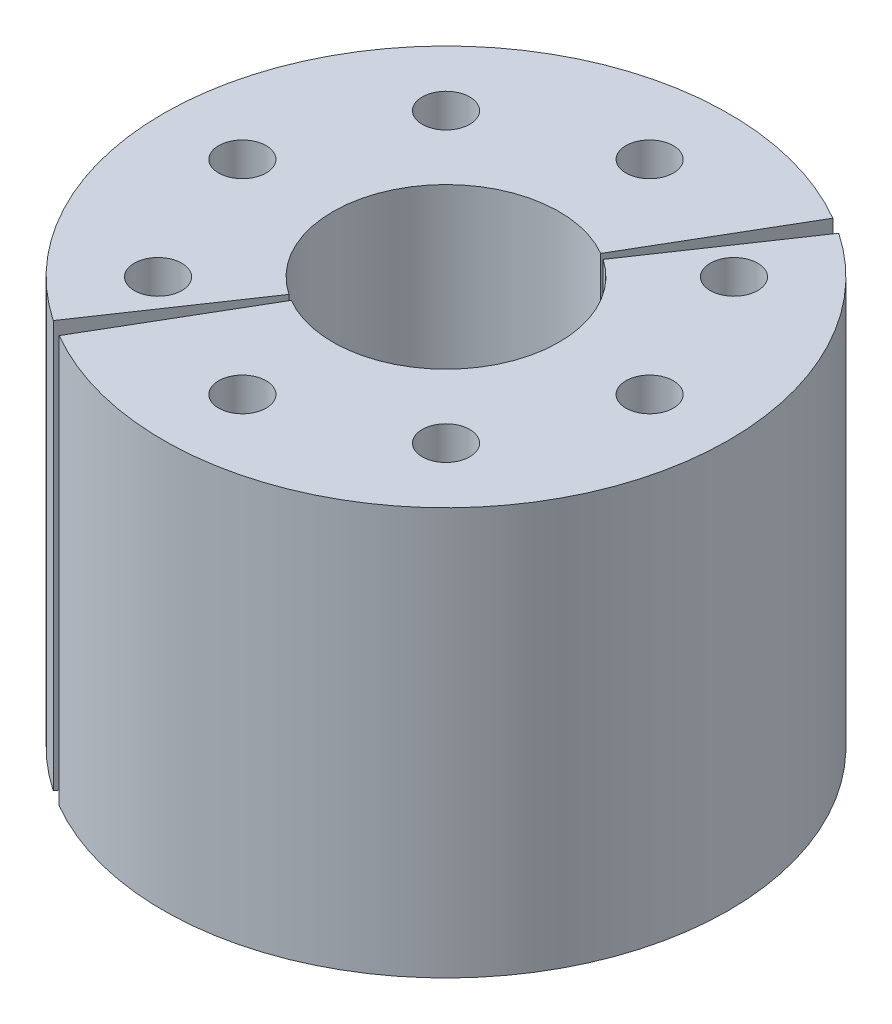
ISO-10303-21;
HEADER;
FILE_DESCRIPTION(('STEP AP214'),'2;1');
FILE_NAME('part.step','',(''),(''),'','','');
FILE_SCHEMA(('AUTOMOTIVE_DESIGN { 1 0 10303 214 1 1 1 1 }'));
ENDSEC;
DATA;
#1=APPLICATION_CONTEXT('core data for automotive mechanical design processes');
#2=APPLICATION_PROTOCOL_DEFINITION('international standard','automotive_design',2000,#1);
#3=PRODUCT_CONTEXT('',#1,'mechanical');
#4=PRODUCT('Part','Part','',(#3));
#5=PRODUCT_RELATED_PRODUCT_CATEGORY('part','',(#4));
#6=PRODUCT_DEFINITION_FORMATION('','',#4);
#7=PRODUCT_DEFINITION_CONTEXT('part definition',#1,'design');
#8=PRODUCT_DEFINITION('design','',#6,#7);
#9=PRODUCT_DEFINITION_SHAPE('','',#8);
#10=(LENGTH_UNIT() NAMED_UNIT(*) SI_UNIT(.MILLI.,.METRE.));
#11=(NAMED_UNIT(*) PLANE_ANGLE_UNIT() SI_UNIT($,.RADIAN.));
#12=(NAMED_UNIT(*) SI_UNIT($,.STERADIAN.) SOLID_ANGLE_UNIT());
#13=UNCERTAINTY_MEASURE_WITH_UNIT(LENGTH_MEASURE(1.E-05),#10,'distance_accuracy_value','');
#14=(GEOMETRIC_REPRESENTATION_CONTEXT(3) GLOBAL_UNCERTAINTY_ASSIGNED_CONTEXT((#13)) GLOBAL_UNIT_ASSIGNED_CONTEXT((#10,
#11,#12)) REPRESENTATION_CONTEXT('',''));
#15=CARTESIAN_POINT('',(0.,0.,0.));
#16=DIRECTION('',(0.,0.,1.));
#17=DIRECTION('',(1.,0.,0.));
#18=AXIS2_PLACEMENT_3D('',#15,#16,#17);
#19=CARTESIAN_POINT('',(0.,36.,0.));
#20=DIRECTION('',(0.863656991008905,0.,0.504079955841773));
#21=DIRECTION('',(0.504079955841773,0.,-0.863656991008905));
#22=AXIS2_PLACEMENT_3D('',#19,#20,#21);
#23=PLANE('',#22);
#24=DIRECTION('',(-0.504079955841773,0.,0.863656991008905));
#25=VECTOR('',#24,1.);
#26=CARTESIAN_POINT('',(0.,0.,0.));
#27=LINE('',#26,#25);
#28=CARTESIAN_POINT('',(-5.04079955841773,0.,8.63656991008905));
#29=VERTEX_POINT('',#28);
#30=CARTESIAN_POINT('',(-12.6019988960443,0.,21.5914247752226));
#31=VERTEX_POINT('',#30);
#32=EDGE_CURVE('E144',#29,#31,#27,.T.);
#33=ORIENTED_EDGE('',*,*,#32,.T.);
#34=DIRECTION('',(0.,-1.,0.));
#35=VECTOR('',#34,1.);
#36=CARTESIAN_POINT('',(-12.6019988960443,36.,21.5914247752226));
#37=LINE('',#36,#35);
#38=CARTESIAN_POINT('',(-12.6019988960443,36.,21.5914247752226));
#39=VERTEX_POINT('',#38);
#40=EDGE_CURVE('E13',#39,#31,#37,.T.);
#41=ORIENTED_EDGE('',*,*,#40,.F.);
#42=DIRECTION('',(-0.504079955841773,0.,0.863656991008905));
#43=VECTOR('',#42,1.);
#44=CARTESIAN_POINT('',(0.,36.,0.));
#45=LINE('',#44,#43);
#46=CARTESIAN_POINT('',(-5.04079955841773,36.,8.63656991008905));
#47=VERTEX_POINT('',#46);
#48=EDGE_CURVE('E118',#47,#39,#45,.T.);
#49=ORIENTED_EDGE('',*,*,#48,.F.);
#50=DIRECTION('',(0.,-1.,0.));
#51=VECTOR('',#50,1.);
#52=CARTESIAN_POINT('',(-5.04079955841773,36.,8.63656991008905));
#53=LINE('',#52,#51);
#54=EDGE_CURVE('E85',#47,#29,#53,.T.);
#55=ORIENTED_EDGE('',*,*,#54,.T.);
#56=EDGE_LOOP('',(#33,#41,#49,#55));
#57=FACE_BOUND('',#56,.T.);
#58=ADVANCED_FACE('F68',(#57),#23,.F.);
#59=CARTESIAN_POINT('',(0.,36.,0.));
#60=DIRECTION('',(0.,-1.,0.));
#61=DIRECTION('',(0.,0.,-1.));
#62=AXIS2_PLACEMENT_3D('',#59,#60,#61);
#63=CYLINDRICAL_SURFACE('',#62,25.);
#64=CARTESIAN_POINT('',(0.,0.,0.));
#65=DIRECTION('',(0.,1.,0.));
#66=DIRECTION('',(0.,0.,1.));
#67=AXIS2_PLACEMENT_3D('',#64,#65,#66);
#68=CIRCLE('',#67,25.);
#69=CARTESIAN_POINT('',(14.0158599127635,0.,-20.7015861929899));
#70=VERTEX_POINT('',#69);
#71=EDGE_CURVE('E123',#31,#70,#68,.T.);
#72=ORIENTED_EDGE('',*,*,#71,.T.);
#73=DIRECTION('',(0.,-1.,0.));
#74=VECTOR('',#73,1.);
#75=CARTESIAN_POINT('',(14.0158599127635,36.,-20.7015861929899));
#76=LINE('',#75,#74);
#77=CARTESIAN_POINT('',(14.0158599127635,36.,-20.7015861929899));
#78=VERTEX_POINT('',#77);
#79=EDGE_CURVE('E77',#78,#70,#76,.T.);
#80=ORIENTED_EDGE('',*,*,#79,.F.);
#81=CARTESIAN_POINT('',(0.,36.,0.));
#82=DIRECTION('',(0.,1.,0.));
#83=DIRECTION('',(0.,0.,1.));
#84=AXIS2_PLACEMENT_3D('',#81,#82,#83);
#85=CIRCLE('',#84,25.);
#86=EDGE_CURVE('E110',#39,#78,#85,.T.);
#87=ORIENTED_EDGE('',*,*,#86,.F.);
#88=ORIENTED_EDGE('',*,*,#40,.T.);
#89=EDGE_LOOP('',(#72,#80,#87,#88));
#90=FACE_BOUND('',#89,.T.);
#91=ADVANCED_FACE('F122',(#90),#63,.T.);
#92=CARTESIAN_POINT('',(0.,36.,0.));
#93=DIRECTION('',(-0.828063447719594,0.,-0.560634396510542));
#94=DIRECTION('',(-0.560634396510542,0.,0.828063447719594));
#95=AXIS2_PLACEMENT_3D('',#92,#93,#94);
#96=PLANE('',#95);
#97=DIRECTION('',(0.560634396510542,0.,-0.828063447719594));
#98=VECTOR('',#97,1.);
#99=CARTESIAN_POINT('',(0.,0.,0.));
#100=LINE('',#99,#98);
#101=CARTESIAN_POINT('',(5.60634396510542,0.,-8.28063447719594));
#102=VERTEX_POINT('',#101);
#103=EDGE_CURVE('E147',#102,#70,#100,.T.);
#104=ORIENTED_EDGE('',*,*,#103,.F.);
#105=DIRECTION('',(0.,-1.,0.));
#106=VECTOR('',#105,1.);
#107=CARTESIAN_POINT('',(5.60634396510542,36.,-8.28063447719594));
#108=LINE('',#107,#106);
#109=CARTESIAN_POINT('',(5.60634396510542,36.,-8.28063447719594));
#110=VERTEX_POINT('',#109);
#111=EDGE_CURVE('E99',#110,#102,#108,.T.);
#112=ORIENTED_EDGE('',*,*,#111,.F.);
#113=DIRECTION('',(0.560634396510542,0.,-0.828063447719594));
#114=VECTOR('',#113,1.);
#115=CARTESIAN_POINT('',(0.,36.,0.));
#116=LINE('',#115,#114);
#117=EDGE_CURVE('E117',#110,#78,#116,.T.);
#118=ORIENTED_EDGE('',*,*,#117,.T.);
#119=ORIENTED_EDGE('',*,*,#79,.T.);
#120=EDGE_LOOP('',(#104,#112,#118,#119));
#121=FACE_BOUND('',#120,.T.);
#122=ADVANCED_FACE('F126',(#121),#96,.T.);
#123=CARTESIAN_POINT('',(12.7279220613578,36.,-12.7279220613579));
#124=DIRECTION('',(0.,-1.,0.));
#125=DIRECTION('',(0.,0.,-1.));
#126=AXIS2_PLACEMENT_3D('',#123,#124,#125);
#127=CYLINDRICAL_SURFACE('',#126,2.1);
#128=CARTESIAN_POINT('',(12.7279220613578,36.,-12.7279220613579));
#129=DIRECTION('',(0.,1.,0.));
#130=DIRECTION('',(0.,0.,1.));
#131=AXIS2_PLACEMENT_3D('',#128,#129,#130);
#132=CIRCLE('',#131,2.1);
#133=CARTESIAN_POINT('',(12.7279220613578,36.,-10.6279220613579));
#134=VERTEX_POINT('',#133);
#135=EDGE_CURVE('E166',#134,#134,#132,.T.);
#136=ORIENTED_EDGE('',*,*,#135,.T.);
#137=EDGE_LOOP('',(#136));
#138=FACE_BOUND('',#137,.T.);
#139=CARTESIAN_POINT('',(12.7279220613578,0.,-12.7279220613579));
#140=DIRECTION('',(0.,1.,0.));
#141=DIRECTION('',(0.,0.,1.));
#142=AXIS2_PLACEMENT_3D('',#139,#140,#141);
#143=CIRCLE('',#142,2.1);
#144=CARTESIAN_POINT('',(12.7279220613578,0.,-10.6279220613579));
#145=VERTEX_POINT('',#144);
#146=EDGE_CURVE('E141',#145,#145,#143,.T.);
#147=ORIENTED_EDGE('',*,*,#146,.F.);
#148=EDGE_LOOP('',(#147));
#149=FACE_BOUND('',#148,.T.);
#150=ADVANCED_FACE('F170',(#138,#149),#127,.F.);
#151=CARTESIAN_POINT('',(18.,36.,0.));
#152=DIRECTION('',(0.,-1.,0.));
#153=DIRECTION('',(0.,0.,-1.));
#154=AXIS2_PLACEMENT_3D('',#151,#152,#153);
#155=CYLINDRICAL_SURFACE('',#154,2.1);
#156=CARTESIAN_POINT('',(18.,36.,0.));
#157=DIRECTION('',(0.,1.,0.));
#158=DIRECTION('',(0.,0.,1.));
#159=AXIS2_PLACEMENT_3D('',#156,#157,#158);
#160=CIRCLE('',#159,2.1);
#161=CARTESIAN_POINT('',(18.,36.,2.1));
#162=VERTEX_POINT('',#161);
#163=EDGE_CURVE('E161',#162,#162,#160,.T.);
#164=ORIENTED_EDGE('',*,*,#163,.T.);
#165=EDGE_LOOP('',(#164));
#166=FACE_BOUND('',#165,.T.);
#167=CARTESIAN_POINT('',(18.,0.,0.));
#168=DIRECTION('',(0.,1.,0.));
#169=DIRECTION('',(0.,0.,1.));
#170=AXIS2_PLACEMENT_3D('',#167,#168,#169);
#171=CIRCLE('',#170,2.1);
#172=CARTESIAN_POINT('',(18.,0.,2.1));
#173=VERTEX_POINT('',#172);
#174=EDGE_CURVE('E138',#173,#173,#171,.T.);
#175=ORIENTED_EDGE('',*,*,#174,.F.);
#176=EDGE_LOOP('',(#175));
#177=FACE_BOUND('',#176,.T.);
#178=ADVANCED_FACE('F196',(#166,#177),#155,.F.);
#179=CARTESIAN_POINT('',(12.7279220613578,36.,12.7279220613579));
#180=DIRECTION('',(0.,-1.,0.));
#181=DIRECTION('',(0.,0.,-1.));
#182=AXIS2_PLACEMENT_3D('',#179,#180,#181);
#183=CYLINDRICAL_SURFACE('',#182,2.1);
#184=CARTESIAN_POINT('',(12.7279220613578,36.,12.7279220613579));
#185=DIRECTION('',(0.,1.,0.));
#186=DIRECTION('',(0.,0.,1.));
#187=AXIS2_PLACEMENT_3D('',#184,#185,#186);
#188=CIRCLE('',#187,2.1);
#189=CARTESIAN_POINT('',(12.7279220613578,36.,14.8279220613579));
#190=VERTEX_POINT('',#189);
#191=EDGE_CURVE('E156',#190,#190,#188,.T.);
#192=ORIENTED_EDGE('',*,*,#191,.T.);
#193=EDGE_LOOP('',(#192));
#194=FACE_BOUND('',#193,.T.);
#195=CARTESIAN_POINT('',(12.7279220613578,0.,12.7279220613579));
#196=DIRECTION('',(0.,1.,0.));
#197=DIRECTION('',(0.,0.,1.));
#198=AXIS2_PLACEMENT_3D('',#195,#196,#197);
#199=CIRCLE('',#198,2.1);
#200=CARTESIAN_POINT('',(12.7279220613578,0.,14.8279220613579));
#201=VERTEX_POINT('',#200);
#202=EDGE_CURVE('E135',#201,#201,#199,.T.);
#203=ORIENTED_EDGE('',*,*,#202,.F.);
#204=EDGE_LOOP('',(#203));
#205=FACE_BOUND('',#204,.T.);
#206=ADVANCED_FACE('F198',(#194,#205),#183,.F.);
#207=CARTESIAN_POINT('',(0.,36.,18.));
#208=DIRECTION('',(0.,-1.,0.));
#209=DIRECTION('',(0.,0.,-1.));
#210=AXIS2_PLACEMENT_3D('',#207,#208,#209);
#211=CYLINDRICAL_SURFACE('',#210,2.1);
#212=CARTESIAN_POINT('',(0.,36.,18.));
#213=DIRECTION('',(0.,1.,0.));
#214=DIRECTION('',(0.,0.,1.));
#215=AXIS2_PLACEMENT_3D('',#212,#213,#214);
#216=CIRCLE('',#215,2.1);
#217=CARTESIAN_POINT('',(0.,36.,20.1));
#218=VERTEX_POINT('',#217);
#219=EDGE_CURVE('E152',#218,#218,#216,.T.);
#220=ORIENTED_EDGE('',*,*,#219,.T.);
#221=EDGE_LOOP('',(#220));
#222=FACE_BOUND('',#221,.T.);
#223=CARTESIAN_POINT('',(0.,0.,18.));
#224=DIRECTION('',(0.,1.,0.));
#225=DIRECTION('',(0.,0.,1.));
#226=AXIS2_PLACEMENT_3D('',#223,#224,#225);
#227=CIRCLE('',#226,2.1);
#228=CARTESIAN_POINT('',(0.,0.,20.1));
#229=VERTEX_POINT('',#228);
#230=EDGE_CURVE('E132',#229,#229,#227,.T.);
#231=ORIENTED_EDGE('',*,*,#230,.F.);
#232=EDGE_LOOP('',(#231));
#233=FACE_BOUND('',#232,.T.);
#234=ADVANCED_FACE('F70',(#222,#233),#211,.F.);
#235=CARTESIAN_POINT('',(0.,36.,0.));
#236=DIRECTION('',(0.,-1.,0.));
#237=DIRECTION('',(0.,0.,-1.));
#238=AXIS2_PLACEMENT_3D('',#235,#236,#237);
#239=CYLINDRICAL_SURFACE('',#238,10.);
#240=CARTESIAN_POINT('',(0.,0.,0.));
#241=DIRECTION('',(0.,1.,0.));
#242=DIRECTION('',(0.,0.,1.));
#243=AXIS2_PLACEMENT_3D('',#240,#241,#242);
#244=CIRCLE('',#243,10.);
#245=EDGE_CURVE('E149',#29,#102,#244,.T.);
#246=ORIENTED_EDGE('',*,*,#245,.F.);
#247=ORIENTED_EDGE('',*,*,#54,.F.);
#248=CARTESIAN_POINT('',(0.,36.,0.));
#249=DIRECTION('',(0.,1.,0.));
#250=DIRECTION('',(0.,0.,1.));
#251=AXIS2_PLACEMENT_3D('',#248,#249,#250);
#252=CIRCLE('',#251,10.);
#253=EDGE_CURVE('E127',#47,#110,#252,.T.);
#254=ORIENTED_EDGE('',*,*,#253,.T.);
#255=ORIENTED_EDGE('',*,*,#111,.T.);
#256=EDGE_LOOP('',(#246,#247,#254,#255));
#257=FACE_BOUND('',#256,.T.);
#258=ADVANCED_FACE('F175',(#257),#239,.F.);
#259=CARTESIAN_POINT('',(0.,36.,0.));
#260=DIRECTION('',(0.,1.,0.));
#261=DIRECTION('',(0.,0.,1.));
#262=AXIS2_PLACEMENT_3D('',#259,#260,#261);
#263=PLANE('',#262);
#264=ORIENTED_EDGE('',*,*,#219,.F.);
#265=EDGE_LOOP('',(#264));
#266=FACE_BOUND('',#265,.T.);
#267=ORIENTED_EDGE('',*,*,#191,.F.);
#268=EDGE_LOOP('',(#267));
#269=FACE_BOUND('',#268,.T.);
#270=ORIENTED_EDGE('',*,*,#163,.F.);
#271=EDGE_LOOP('',(#270));
#272=FACE_BOUND('',#271,.T.);
#273=ORIENTED_EDGE('',*,*,#135,.F.);
#274=EDGE_LOOP('',(#273));
#275=FACE_BOUND('',#274,.T.);
#276=ORIENTED_EDGE('',*,*,#48,.T.);
#277=ORIENTED_EDGE('',*,*,#86,.T.);
#278=ORIENTED_EDGE('',*,*,#117,.F.);
#279=ORIENTED_EDGE('',*,*,#253,.F.);
#280=EDGE_LOOP('',(#276,#277,#278,#279));
#281=FACE_BOUND('',#280,.T.);
#282=ADVANCED_FACE('F114',(#266,#269,#272,#275,#281),#263,.T.);
#283=CARTESIAN_POINT('',(0.,0.,0.));
#284=DIRECTION('',(0.,1.,0.));
#285=DIRECTION('',(0.,0.,1.));
#286=AXIS2_PLACEMENT_3D('',#283,#284,#285);
#287=PLANE('',#286);
#288=ORIENTED_EDGE('',*,*,#230,.T.);
#289=EDGE_LOOP('',(#288));
#290=FACE_BOUND('',#289,.T.);
#291=ORIENTED_EDGE('',*,*,#202,.T.);
#292=EDGE_LOOP('',(#291));
#293=FACE_BOUND('',#292,.T.);
#294=ORIENTED_EDGE('',*,*,#174,.T.);
#295=EDGE_LOOP('',(#294));
#296=FACE_BOUND('',#295,.T.);
#297=ORIENTED_EDGE('',*,*,#146,.T.);
#298=EDGE_LOOP('',(#297));
#299=FACE_BOUND('',#298,.T.);
#300=ORIENTED_EDGE('',*,*,#32,.F.);
#301=ORIENTED_EDGE('',*,*,#245,.T.);
#302=ORIENTED_EDGE('',*,*,#103,.T.);
#303=ORIENTED_EDGE('',*,*,#71,.F.);
#304=EDGE_LOOP('',(#300,#301,#302,#303));
#305=FACE_BOUND('',#304,.T.);
#306=ADVANCED_FACE('F174',(#290,#293,#296,#299,#305),#287,.F.);
#307=CLOSED_SHELL('',(#58,#91,#122,#150,#178,#206,#234,#258,#282,#306));
#308=MANIFOLD_SOLID_BREP('B2',#307);
#309=CARTESIAN_POINT('',(0.,36.,0.));
#310=DIRECTION('',(-0.863656991008905,0.,-0.504079955841774));
#311=DIRECTION('',(-0.504079955841774,0.,0.863656991008905));
#312=AXIS2_PLACEMENT_3D('',#309,#310,#311);
#313=PLANE('',#312);
#314=DIRECTION('',(0.504079955841774,0.,-0.863656991008905));
#315=VECTOR('',#314,1.);
#316=CARTESIAN_POINT('',(0.,0.,0.));
#317=LINE('',#316,#315);
#318=CARTESIAN_POINT('',(5.04079955841774,0.,-8.63656991008905));
#319=VERTEX_POINT('',#318);
#320=CARTESIAN_POINT('',(12.6019988960443,0.,-21.5914247752226));
#321=VERTEX_POINT('',#320);
#322=EDGE_CURVE('E351',#319,#321,#317,.T.);
#323=ORIENTED_EDGE('',*,*,#322,.T.);
#324=DIRECTION('',(0.,-1.,0.));
#325=VECTOR('',#324,1.);
#326=CARTESIAN_POINT('',(12.6019988960443,36.,-21.5914247752226));
#327=LINE('',#326,#325);
#328=CARTESIAN_POINT('',(12.6019988960443,36.,-21.5914247752226));
#329=VERTEX_POINT('',#328);
#330=EDGE_CURVE('E66',#329,#321,#327,.T.);
#331=ORIENTED_EDGE('',*,*,#330,.F.);
#332=DIRECTION('',(0.504079955841774,0.,-0.863656991008905));
#333=VECTOR('',#332,1.);
#334=CARTESIAN_POINT('',(0.,36.,0.));
#335=LINE('',#334,#333);
#336=CARTESIAN_POINT('',(5.04079955841774,36.,-8.63656991008905));
#337=VERTEX_POINT('',#336);
#338=EDGE_CURVE('E325',#337,#329,#335,.T.);
#339=ORIENTED_EDGE('',*,*,#338,.F.);
#340=DIRECTION('',(0.,-1.,0.));
#341=VECTOR('',#340,1.);
#342=CARTESIAN_POINT('',(5.04079955841774,36.,-8.63656991008905));
#343=LINE('',#342,#341);
#344=EDGE_CURVE('E292',#337,#319,#343,.T.);
#345=ORIENTED_EDGE('',*,*,#344,.T.);
#346=EDGE_LOOP('',(#323,#331,#339,#345));
#347=FACE_BOUND('',#346,.T.);
#348=ADVANCED_FACE('F275',(#347),#313,.F.);
#349=CARTESIAN_POINT('',(0.,36.,0.));
#350=DIRECTION('',(0.,-1.,0.));
#351=DIRECTION('',(0.,0.,-1.));
#352=AXIS2_PLACEMENT_3D('',#349,#350,#351);
#353=CYLINDRICAL_SURFACE('',#352,25.);
#354=CARTESIAN_POINT('',(0.,0.,0.));
#355=DIRECTION('',(0.,1.,0.));
#356=DIRECTION('',(0.,0.,1.));
#357=AXIS2_PLACEMENT_3D('',#354,#355,#356);
#358=CIRCLE('',#357,25.);
#359=CARTESIAN_POINT('',(-14.0158599127635,0.,20.7015861929899));
#360=VERTEX_POINT('',#359);
#361=EDGE_CURVE('E330',#321,#360,#358,.T.);
#362=ORIENTED_EDGE('',*,*,#361,.T.);
#363=DIRECTION('',(0.,-1.,0.));
#364=VECTOR('',#363,1.);
#365=CARTESIAN_POINT('',(-14.0158599127635,36.,20.7015861929899));
#366=LINE('',#365,#364);
#367=CARTESIAN_POINT('',(-14.0158599127635,36.,20.7015861929899));
#368=VERTEX_POINT('',#367);
#369=EDGE_CURVE('E284',#368,#360,#366,.T.);
#370=ORIENTED_EDGE('',*,*,#369,.F.);
#371=CARTESIAN_POINT('',(0.,36.,0.));
#372=DIRECTION('',(0.,1.,0.));
#373=DIRECTION('',(0.,0.,1.));
#374=AXIS2_PLACEMENT_3D('',#371,#372,#373);
#375=CIRCLE('',#374,25.);
#376=EDGE_CURVE('E317',#329,#368,#375,.T.);
#377=ORIENTED_EDGE('',*,*,#376,.F.);
#378=ORIENTED_EDGE('',*,*,#330,.T.);
#379=EDGE_LOOP('',(#362,#370,#377,#378));
#380=FACE_BOUND('',#379,.T.);
#381=ADVANCED_FACE('F329',(#380),#353,.T.);
#382=CARTESIAN_POINT('',(0.,36.,0.));
#383=DIRECTION('',(0.828063447719594,0.,0.560634396510542));
#384=DIRECTION('',(0.560634396510542,0.,-0.828063447719594));
#385=AXIS2_PLACEMENT_3D('',#382,#383,#384);
#386=PLANE('',#385);
#387=DIRECTION('',(-0.560634396510542,0.,0.828063447719594));
#388=VECTOR('',#387,1.);
#389=CARTESIAN_POINT('',(0.,0.,0.));
#390=LINE('',#389,#388);
#391=CARTESIAN_POINT('',(-5.60634396510542,0.,8.28063447719594));
#392=VERTEX_POINT('',#391);
#393=EDGE_CURVE('E354',#392,#360,#390,.T.);
#394=ORIENTED_EDGE('',*,*,#393,.F.);
#395=DIRECTION('',(0.,-1.,0.));
#396=VECTOR('',#395,1.);
#397=CARTESIAN_POINT('',(-5.60634396510542,36.,8.28063447719594));
#398=LINE('',#397,#396);
#399=CARTESIAN_POINT('',(-5.60634396510542,36.,8.28063447719594));
#400=VERTEX_POINT('',#399);
#401=EDGE_CURVE('E306',#400,#392,#398,.T.);
#402=ORIENTED_EDGE('',*,*,#401,.F.);
#403=DIRECTION('',(-0.560634396510542,0.,0.828063447719594));
#404=VECTOR('',#403,1.);
#405=CARTESIAN_POINT('',(0.,36.,0.));
#406=LINE('',#405,#404);
#407=EDGE_CURVE('E324',#400,#368,#406,.T.);
#408=ORIENTED_EDGE('',*,*,#407,.T.);
#409=ORIENTED_EDGE('',*,*,#369,.T.);
#410=EDGE_LOOP('',(#394,#402,#408,#409));
#411=FACE_BOUND('',#410,.T.);
#412=ADVANCED_FACE('F333',(#411),#386,.T.);
#413=CARTESIAN_POINT('',(-18.,36.,0.));
#414=DIRECTION('',(0.,-1.,0.));
#415=DIRECTION('',(0.,0.,-1.));
#416=AXIS2_PLACEMENT_3D('',#413,#414,#415);
#417=CYLINDRICAL_SURFACE('',#416,2.1);
#418=CARTESIAN_POINT('',(-18.,36.,0.));
#419=DIRECTION('',(0.,1.,0.));
#420=DIRECTION('',(0.,0.,1.));
#421=AXIS2_PLACEMENT_3D('',#418,#419,#420);
#422=CIRCLE('',#421,2.1);
#423=CARTESIAN_POINT('',(-18.,36.,2.1));
#424=VERTEX_POINT('',#423);
#425=EDGE_CURVE('E373',#424,#424,#422,.T.);
#426=ORIENTED_EDGE('',*,*,#425,.T.);
#427=EDGE_LOOP('',(#426));
#428=FACE_BOUND('',#427,.T.);
#429=CARTESIAN_POINT('',(-18.,0.,0.));
#430=DIRECTION('',(0.,1.,0.));
#431=DIRECTION('',(0.,0.,1.));
#432=AXIS2_PLACEMENT_3D('',#429,#430,#431);
#433=CIRCLE('',#432,2.1);
#434=CARTESIAN_POINT('',(-18.,0.,2.1));
#435=VERTEX_POINT('',#434);
#436=EDGE_CURVE('E348',#435,#435,#433,.T.);
#437=ORIENTED_EDGE('',*,*,#436,.F.);
#438=EDGE_LOOP('',(#437));
#439=FACE_BOUND('',#438,.T.);
#440=ADVANCED_FACE('F377',(#428,#439),#417,.F.);
#441=CARTESIAN_POINT('',(-12.7279220613579,36.,-12.7279220613578));
#442=DIRECTION('',(0.,-1.,0.));
#443=DIRECTION('',(0.,0.,-1.));
#444=AXIS2_PLACEMENT_3D('',#441,#442,#443);
#445=CYLINDRICAL_SURFACE('',#444,2.1);
#446=CARTESIAN_POINT('',(-12.7279220613579,36.,-12.7279220613578));
#447=DIRECTION('',(0.,1.,0.));
#448=DIRECTION('',(0.,0.,1.));
#449=AXIS2_PLACEMENT_3D('',#446,#447,#448);
#450=CIRCLE('',#449,2.1);
#451=CARTESIAN_POINT('',(-12.7279220613579,36.,-10.6279220613578));
#452=VERTEX_POINT('',#451);
#453=EDGE_CURVE('E368',#452,#452,#450,.T.);
#454=ORIENTED_EDGE('',*,*,#453,.T.);
#455=EDGE_LOOP('',(#454));
#456=FACE_BOUND('',#455,.T.);
#457=CARTESIAN_POINT('',(-12.7279220613579,0.,-12.7279220613578));
#458=DIRECTION('',(0.,1.,0.));
#459=DIRECTION('',(0.,0.,1.));
#460=AXIS2_PLACEMENT_3D('',#457,#458,#459);
#461=CIRCLE('',#460,2.1);
#462=CARTESIAN_POINT('',(-12.7279220613579,0.,-10.6279220613578));
#463=VERTEX_POINT('',#462);
#464=EDGE_CURVE('E345',#463,#463,#461,.T.);
#465=ORIENTED_EDGE('',*,*,#464,.F.);
#466=EDGE_LOOP('',(#465));
#467=FACE_BOUND('',#466,.T.);
#468=ADVANCED_FACE('F403',(#456,#467),#445,.F.);
#469=CARTESIAN_POINT('',(0.,36.,-18.));
#470=DIRECTION('',(0.,-1.,0.));
#471=DIRECTION('',(0.,0.,-1.));
#472=AXIS2_PLACEMENT_3D('',#469,#470,#471);
#473=CYLINDRICAL_SURFACE('',#472,2.1);
#474=CARTESIAN_POINT('',(0.,36.,-18.));
#475=DIRECTION('',(0.,1.,0.));
#476=DIRECTION('',(0.,0.,1.));
#477=AXIS2_PLACEMENT_3D('',#474,#475,#476);
#478=CIRCLE('',#477,2.1);
#479=CARTESIAN_POINT('',(0.,36.,-15.9));
#480=VERTEX_POINT('',#479);
#481=EDGE_CURVE('E363',#480,#480,#478,.T.);
#482=ORIENTED_EDGE('',*,*,#481,.T.);
#483=EDGE_LOOP('',(#482));
#484=FACE_BOUND('',#483,.T.);
#485=CARTESIAN_POINT('',(0.,0.,-18.));
#486=DIRECTION('',(0.,1.,0.));
#487=DIRECTION('',(0.,0.,1.));
#488=AXIS2_PLACEMENT_3D('',#485,#486,#487);
#489=CIRCLE('',#488,2.1);
#490=CARTESIAN_POINT('',(0.,0.,-15.9));
#491=VERTEX_POINT('',#490);
#492=EDGE_CURVE('E342',#491,#491,#489,.T.);
#493=ORIENTED_EDGE('',*,*,#492,.F.);
#494=EDGE_LOOP('',(#493));
#495=FACE_BOUND('',#494,.T.);
#496=ADVANCED_FACE('F405',(#484,#495),#473,.F.);
#497=CARTESIAN_POINT('',(-12.7279220613579,36.,12.7279220613578));
#498=DIRECTION('',(0.,-1.,0.));
#499=DIRECTION('',(0.,0.,-1.));
#500=AXIS2_PLACEMENT_3D('',#497,#498,#499);
#501=CYLINDRICAL_SURFACE('',#500,2.1);
#502=CARTESIAN_POINT('',(-12.7279220613579,36.,12.7279220613578));
#503=DIRECTION('',(0.,1.,0.));
#504=DIRECTION('',(0.,0.,1.));
#505=AXIS2_PLACEMENT_3D('',#502,#503,#504);
#506=CIRCLE('',#505,2.1);
#507=CARTESIAN_POINT('',(-12.7279220613579,36.,14.8279220613578));
#508=VERTEX_POINT('',#507);
#509=EDGE_CURVE('E359',#508,#508,#506,.T.);
#510=ORIENTED_EDGE('',*,*,#509,.T.);
#511=EDGE_LOOP('',(#510));
#512=FACE_BOUND('',#511,.T.);
#513=CARTESIAN_POINT('',(-12.7279220613579,0.,12.7279220613578));
#514=DIRECTION('',(0.,1.,0.));
#515=DIRECTION('',(0.,0.,1.));
#516=AXIS2_PLACEMENT_3D('',#513,#514,#515);
#517=CIRCLE('',#516,2.1);
#518=CARTESIAN_POINT('',(-12.7279220613579,0.,14.8279220613578));
#519=VERTEX_POINT('',#518);
#520=EDGE_CURVE('E339',#519,#519,#517,.T.);
#521=ORIENTED_EDGE('',*,*,#520,.F.);
#522=EDGE_LOOP('',(#521));
#523=FACE_BOUND('',#522,.T.);
#524=ADVANCED_FACE('F277',(#512,#523),#501,.F.);
#525=CARTESIAN_POINT('',(0.,36.,0.));
#526=DIRECTION('',(0.,-1.,0.));
#527=DIRECTION('',(0.,0.,-1.));
#528=AXIS2_PLACEMENT_3D('',#525,#526,#527);
#529=CYLINDRICAL_SURFACE('',#528,10.);
#530=CARTESIAN_POINT('',(0.,0.,0.));
#531=DIRECTION('',(0.,1.,0.));
#532=DIRECTION('',(0.,0.,1.));
#533=AXIS2_PLACEMENT_3D('',#530,#531,#532);
#534=CIRCLE('',#533,10.);
#535=EDGE_CURVE('E356',#319,#392,#534,.T.);
#536=ORIENTED_EDGE('',*,*,#535,.F.);
#537=ORIENTED_EDGE('',*,*,#344,.F.);
#538=CARTESIAN_POINT('',(0.,36.,0.));
#539=DIRECTION('',(0.,1.,0.));
#540=DIRECTION('',(0.,0.,1.));
#541=AXIS2_PLACEMENT_3D('',#538,#539,#540);
#542=CIRCLE('',#541,10.);
#543=EDGE_CURVE('E334',#337,#400,#542,.T.);
#544=ORIENTED_EDGE('',*,*,#543,.T.);
#545=ORIENTED_EDGE('',*,*,#401,.T.);
#546=EDGE_LOOP('',(#536,#537,#544,#545));
#547=FACE_BOUND('',#546,.T.);
#548=ADVANCED_FACE('F382',(#547),#529,.F.);
#549=CARTESIAN_POINT('',(0.,36.,0.));
#550=DIRECTION('',(0.,1.,0.));
#551=DIRECTION('',(0.,0.,1.));
#552=AXIS2_PLACEMENT_3D('',#549,#550,#551);
#553=PLANE('',#552);
#554=ORIENTED_EDGE('',*,*,#509,.F.);
#555=EDGE_LOOP('',(#554));
#556=FACE_BOUND('',#555,.T.);
#557=ORIENTED_EDGE('',*,*,#481,.F.);
#558=EDGE_LOOP('',(#557));
#559=FACE_BOUND('',#558,.T.);
#560=ORIENTED_EDGE('',*,*,#453,.F.);
#561=EDGE_LOOP('',(#560));
#562=FACE_BOUND('',#561,.T.);
#563=ORIENTED_EDGE('',*,*,#425,.F.);
#564=EDGE_LOOP('',(#563));
#565=FACE_BOUND('',#564,.T.);
#566=ORIENTED_EDGE('',*,*,#338,.T.);
#567=ORIENTED_EDGE('',*,*,#376,.T.);
#568=ORIENTED_EDGE('',*,*,#407,.F.);
#569=ORIENTED_EDGE('',*,*,#543,.F.);
#570=EDGE_LOOP('',(#566,#567,#568,#569));
#571=FACE_BOUND('',#570,.T.);
#572=ADVANCED_FACE('F321',(#556,#559,#562,#565,#571),#553,.T.);
#573=CARTESIAN_POINT('',(0.,0.,0.));
#574=DIRECTION('',(0.,1.,0.));
#575=DIRECTION('',(0.,0.,1.));
#576=AXIS2_PLACEMENT_3D('',#573,#574,#575);
#577=PLANE('',#576);
#578=ORIENTED_EDGE('',*,*,#520,.T.);
#579=EDGE_LOOP('',(#578));
#580=FACE_BOUND('',#579,.T.);
#581=ORIENTED_EDGE('',*,*,#492,.T.);
#582=EDGE_LOOP('',(#581));
#583=FACE_BOUND('',#582,.T.);
#584=ORIENTED_EDGE('',*,*,#464,.T.);
#585=EDGE_LOOP('',(#584));
#586=FACE_BOUND('',#585,.T.);
#587=ORIENTED_EDGE('',*,*,#436,.T.);
#588=EDGE_LOOP('',(#587));
#589=FACE_BOUND('',#588,.T.);
#590=ORIENTED_EDGE('',*,*,#322,.F.);
#591=ORIENTED_EDGE('',*,*,#535,.T.);
#592=ORIENTED_EDGE('',*,*,#393,.T.);
#593=ORIENTED_EDGE('',*,*,#361,.F.);
#594=EDGE_LOOP('',(#590,#591,#592,#593));
#595=FACE_BOUND('',#594,.T.);
#596=ADVANCED_FACE('F381',(#580,#583,#586,#589,#595),#577,.F.);
#597=CLOSED_SHELL('',(#348,#381,#412,#440,#468,#496,#524,#548,#572,#596));
#598=MANIFOLD_SOLID_BREP('B7',#597);
#599=ADVANCED_BREP_SHAPE_REPRESENTATION('',(#18,#308,#598),#14);
#600=SHAPE_DEFINITION_REPRESENTATION(#9,#599);
ENDSEC;
END-ISO-10303-21;
